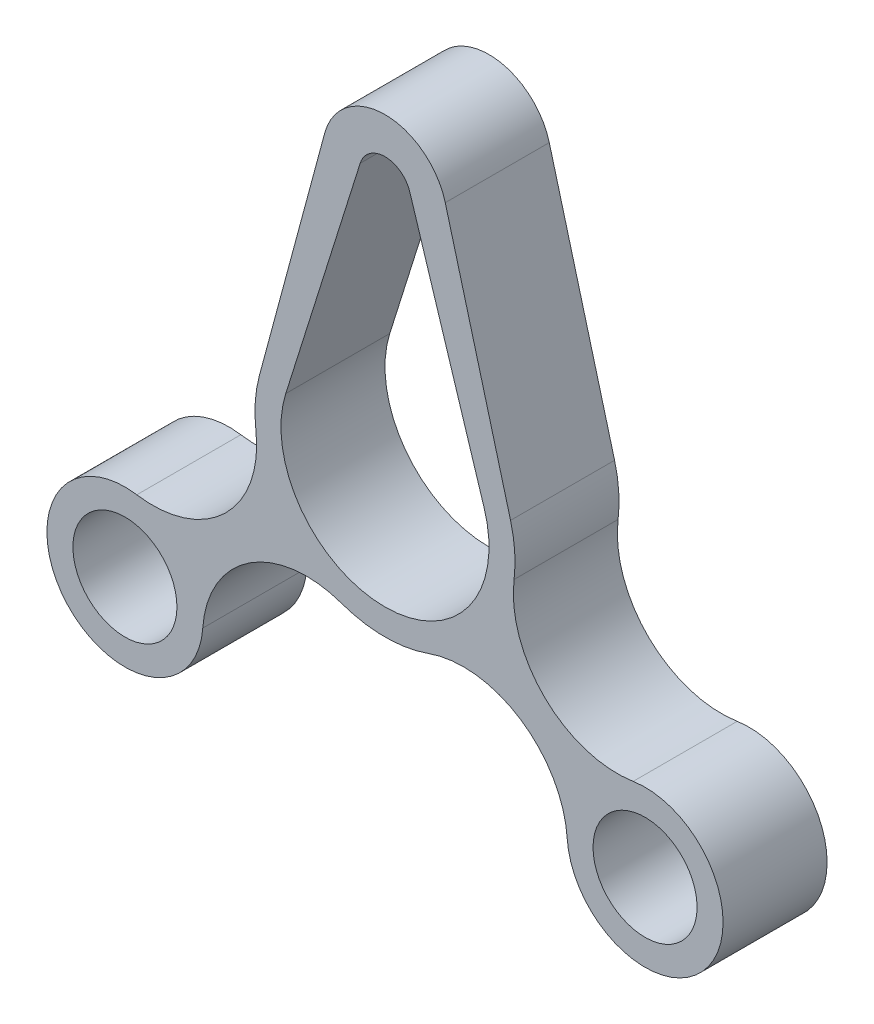
ISO-10303-21;
HEADER;
FILE_DESCRIPTION(('STEP AP214'),'2;1');
FILE_NAME('part.step','',(''),(''),'','','');
FILE_SCHEMA(('AUTOMOTIVE_DESIGN { 1 0 10303 214 1 1 1 1 }'));
ENDSEC;
DATA;
#1=APPLICATION_CONTEXT('core data for automotive mechanical design processes');
#2=APPLICATION_PROTOCOL_DEFINITION('international standard','automotive_design',2000,#1);
#3=PRODUCT_CONTEXT('',#1,'mechanical');
#4=PRODUCT('Part','Part','',(#3));
#5=PRODUCT_RELATED_PRODUCT_CATEGORY('part','',(#4));
#6=PRODUCT_DEFINITION_FORMATION('','',#4);
#7=PRODUCT_DEFINITION_CONTEXT('part definition',#1,'design');
#8=PRODUCT_DEFINITION('design','',#6,#7);
#9=PRODUCT_DEFINITION_SHAPE('','',#8);
#10=(LENGTH_UNIT() NAMED_UNIT(*) SI_UNIT(.MILLI.,.METRE.));
#11=(NAMED_UNIT(*) PLANE_ANGLE_UNIT() SI_UNIT($,.RADIAN.));
#12=(NAMED_UNIT(*) SI_UNIT($,.STERADIAN.) SOLID_ANGLE_UNIT());
#13=UNCERTAINTY_MEASURE_WITH_UNIT(LENGTH_MEASURE(1.E-05),#10,'distance_accuracy_value','');
#14=(GEOMETRIC_REPRESENTATION_CONTEXT(3) GLOBAL_UNCERTAINTY_ASSIGNED_CONTEXT((#13)) GLOBAL_UNIT_ASSIGNED_CONTEXT((#10,
#11,#12)) REPRESENTATION_CONTEXT('',''));
#15=CARTESIAN_POINT('',(0.,0.,0.));
#16=DIRECTION('',(0.,0.,1.));
#17=DIRECTION('',(1.,0.,0.));
#18=AXIS2_PLACEMENT_3D('',#15,#16,#17);
#19=CARTESIAN_POINT('',(-44.6739033054664,-5.40762086816695,10.));
#20=DIRECTION('',(0.,0.,1.));
#21=DIRECTION('',(1.,0.,0.));
#22=AXIS2_PLACEMENT_3D('',#19,#20,#21);
#23=PLANE('',#22);
#24=CARTESIAN_POINT('',(-50.,-40.,10.));
#25=DIRECTION('',(0.,0.,1.));
#26=DIRECTION('',(1.,0.,0.));
#27=AXIS2_PLACEMENT_3D('',#24,#25,#26);
#28=CIRCLE('',#27,10.);
#29=CARTESIAN_POINT('',(-40.,-40.,10.));
#30=VERTEX_POINT('',#29);
#31=EDGE_CURVE('E192',#30,#30,#28,.T.);
#32=ORIENTED_EDGE('',*,*,#31,.F.);
#33=EDGE_LOOP('',(#32));
#34=FACE_BOUND('',#33,.T.);
#35=CARTESIAN_POINT('',(-44.6739033054664,-5.40762086816695,10.));
#36=DIRECTION('',(0.,0.,-1.));
#37=DIRECTION('',(1.,0.,0.));
#38=AXIS2_PLACEMENT_3D('',#35,#36,#37);
#39=CIRCLE('',#38,20.);
#40=CARTESIAN_POINT('',(-24.8188351697036,-3.0042338156483,10.));
#41=VERTEX_POINT('',#40);
#42=CARTESIAN_POINT('',(-47.7173871309142,-25.1746946577858,10.));
#43=VERTEX_POINT('',#42);
#44=EDGE_CURVE('E198',#41,#43,#39,.T.);
#45=ORIENTED_EDGE('',*,*,#44,.T.);
#46=CARTESIAN_POINT('',(-50.,-40.,10.));
#47=DIRECTION('',(0.,0.,1.));
#48=DIRECTION('',(1.,0.,0.));
#49=AXIS2_PLACEMENT_3D('',#46,#47,#48);
#50=CIRCLE('',#49,15.);
#51=CARTESIAN_POINT('',(-35.0352261095039,-41.0273959345487,10.));
#52=VERTEX_POINT('',#51);
#53=EDGE_CURVE('E201',#43,#52,#50,.T.);
#54=ORIENTED_EDGE('',*,*,#53,.T.);
#55=CARTESIAN_POINT('',(-15.0821942555092,-42.3972571806135,10.));
#56=DIRECTION('',(0.,0.,-1.));
#57=DIRECTION('',(-1.,0.,0.));
#58=AXIS2_PLACEMENT_3D('',#55,#56,#57);
#59=CIRCLE('',#58,20.);
#60=CARTESIAN_POINT('',(-8.3789968086162,-23.5540317670075,10.));
#61=VERTEX_POINT('',#60);
#62=EDGE_CURVE('E204',#52,#61,#59,.T.);
#63=ORIENTED_EDGE('',*,*,#62,.T.);
#64=CARTESIAN_POINT('',(0.,0.,10.));
#65=DIRECTION('',(0.,0.,1.));
#66=DIRECTION('',(1.,0.,0.));
#67=AXIS2_PLACEMENT_3D('',#64,#65,#66);
#68=CIRCLE('',#67,25.);
#69=CARTESIAN_POINT('',(8.37899680861619,-23.5540317670075,10.));
#70=VERTEX_POINT('',#69);
#71=EDGE_CURVE('E206',#61,#70,#68,.T.);
#72=ORIENTED_EDGE('',*,*,#71,.T.);
#73=CARTESIAN_POINT('',(15.0821942555092,-42.3972571806135,10.));
#74=DIRECTION('',(0.,0.,-1.));
#75=DIRECTION('',(1.,0.,0.));
#76=AXIS2_PLACEMENT_3D('',#73,#74,#75);
#77=CIRCLE('',#76,20.);
#78=CARTESIAN_POINT('',(35.0352261095039,-41.0273959345487,10.));
#79=VERTEX_POINT('',#78);
#80=EDGE_CURVE('E208',#70,#79,#77,.T.);
#81=ORIENTED_EDGE('',*,*,#80,.T.);
#82=CARTESIAN_POINT('',(50.,-40.,10.));
#83=DIRECTION('',(0.,0.,1.));
#84=DIRECTION('',(-1.,0.,0.));
#85=AXIS2_PLACEMENT_3D('',#82,#83,#84);
#86=CIRCLE('',#85,15.);
#87=CARTESIAN_POINT('',(47.7173871309142,-25.1746946577858,10.));
#88=VERTEX_POINT('',#87);
#89=EDGE_CURVE('E210',#79,#88,#86,.T.);
#90=ORIENTED_EDGE('',*,*,#89,.T.);
#91=CARTESIAN_POINT('',(44.6739033054664,-5.40762086816695,10.));
#92=DIRECTION('',(0.,0.,-1.));
#93=DIRECTION('',(-1.,0.,0.));
#94=AXIS2_PLACEMENT_3D('',#91,#92,#93);
#95=CIRCLE('',#94,20.);
#96=CARTESIAN_POINT('',(24.8188351697036,-3.00423381564831,10.));
#97=VERTEX_POINT('',#96);
#98=EDGE_CURVE('E212',#88,#97,#95,.T.);
#99=ORIENTED_EDGE('',*,*,#98,.T.);
#100=CARTESIAN_POINT('',(0.,0.,10.));
#101=DIRECTION('',(0.,0.,1.));
#102=DIRECTION('',(1.,0.,0.));
#103=AXIS2_PLACEMENT_3D('',#100,#101,#102);
#104=CIRCLE('',#103,25.);
#105=CARTESIAN_POINT('',(24.1402154091466,6.5,10.));
#106=VERTEX_POINT('',#105);
#107=EDGE_CURVE('E214',#97,#106,#104,.T.);
#108=ORIENTED_EDGE('',*,*,#107,.T.);
#109=DIRECTION('',(-0.26,0.965608616365865,0.));
#110=VECTOR('',#109,1.);
#111=CARTESIAN_POINT('',(24.1402154091466,6.5,10.));
#112=LINE('',#111,#110);
#113=CARTESIAN_POINT('',(11.5873033963904,53.12,10.));
#114=VERTEX_POINT('',#113);
#115=EDGE_CURVE('E216',#106,#114,#112,.T.);
#116=ORIENTED_EDGE('',*,*,#115,.T.);
#117=CARTESIAN_POINT('',(0.,50.,10.));
#118=DIRECTION('',(0.,0.,1.));
#119=DIRECTION('',(1.,0.,0.));
#120=AXIS2_PLACEMENT_3D('',#117,#118,#119);
#121=CIRCLE('',#120,12.);
#122=CARTESIAN_POINT('',(-11.5873033963904,53.12,10.));
#123=VERTEX_POINT('',#122);
#124=EDGE_CURVE('E218',#114,#123,#121,.T.);
#125=ORIENTED_EDGE('',*,*,#124,.T.);
#126=DIRECTION('',(-0.26,-0.965608616365865,0.));
#127=VECTOR('',#126,1.);
#128=CARTESIAN_POINT('',(-24.1402154091466,6.5,10.));
#129=LINE('',#128,#127);
#130=CARTESIAN_POINT('',(-24.1402154091466,6.5,10.));
#131=VERTEX_POINT('',#130);
#132=EDGE_CURVE('E220',#123,#131,#129,.T.);
#133=ORIENTED_EDGE('',*,*,#132,.T.);
#134=CARTESIAN_POINT('',(0.,0.,10.));
#135=DIRECTION('',(0.,0.,1.));
#136=DIRECTION('',(1.,0.,0.));
#137=AXIS2_PLACEMENT_3D('',#134,#135,#136);
#138=CIRCLE('',#137,25.);
#139=EDGE_CURVE('E222',#131,#41,#138,.T.);
#140=ORIENTED_EDGE('',*,*,#139,.T.);
#141=EDGE_LOOP('',(#45,#54,#63,#72,#81,#90,#99,#108,#116,#125,#133,#140));
#142=FACE_BOUND('',#141,.T.);
#143=CARTESIAN_POINT('',(50.,-40.,10.));
#144=DIRECTION('',(0.,0.,1.));
#145=DIRECTION('',(-1.,0.,0.));
#146=AXIS2_PLACEMENT_3D('',#143,#144,#145);
#147=CIRCLE('',#146,10.);
#148=CARTESIAN_POINT('',(40.,-40.,10.));
#149=VERTEX_POINT('',#148);
#150=EDGE_CURVE('E186',#149,#149,#147,.T.);
#151=ORIENTED_EDGE('',*,*,#150,.F.);
#152=EDGE_LOOP('',(#151));
#153=FACE_BOUND('',#152,.T.);
#154=DIRECTION('',(-0.3,0.953939201416946,0.));
#155=VECTOR('',#154,1.);
#156=CARTESIAN_POINT('',(19.0787840283389,6.,10.));
#157=LINE('',#156,#155);
#158=CARTESIAN_POINT('',(19.0787840283389,6.,10.));
#159=VERTEX_POINT('',#158);
#160=CARTESIAN_POINT('',(4.76969600708474,51.5,10.));
#161=VERTEX_POINT('',#160);
#162=EDGE_CURVE('E158',#159,#161,#157,.T.);
#163=ORIENTED_EDGE('',*,*,#162,.F.);
#164=CARTESIAN_POINT('',(0.,0.,10.));
#165=DIRECTION('',(0.,0.,1.));
#166=DIRECTION('',(1.,0.,0.));
#167=AXIS2_PLACEMENT_3D('',#164,#165,#166);
#168=CIRCLE('',#167,20.);
#169=CARTESIAN_POINT('',(-19.0787840283389,6.,10.));
#170=VERTEX_POINT('',#169);
#171=EDGE_CURVE('E150',#170,#159,#168,.T.);
#172=ORIENTED_EDGE('',*,*,#171,.F.);
#173=DIRECTION('',(-0.3,-0.953939201416946,0.));
#174=VECTOR('',#173,1.);
#175=CARTESIAN_POINT('',(-19.0787840283389,6.,10.));
#176=LINE('',#175,#174);
#177=CARTESIAN_POINT('',(-4.76969600708474,51.5,10.));
#178=VERTEX_POINT('',#177);
#179=EDGE_CURVE('E172',#178,#170,#176,.T.);
#180=ORIENTED_EDGE('',*,*,#179,.F.);
#181=CARTESIAN_POINT('',(0.,50.,10.));
#182=DIRECTION('',(0.,0.,1.));
#183=DIRECTION('',(1.,0.,0.));
#184=AXIS2_PLACEMENT_3D('',#181,#182,#183);
#185=CIRCLE('',#184,5.00000000000001);
#186=EDGE_CURVE('E170',#161,#178,#185,.T.);
#187=ORIENTED_EDGE('',*,*,#186,.F.);
#188=EDGE_LOOP('',(#163,#172,#180,#187));
#189=FACE_BOUND('',#188,.T.);
#190=ADVANCED_FACE('F37',(#34,#142,#153,#189),#23,.T.);
#191=CARTESIAN_POINT('',(-44.6739033054664,-5.40762086816695,-10.));
#192=DIRECTION('',(0.,0.,1.));
#193=DIRECTION('',(1.,0.,0.));
#194=AXIS2_PLACEMENT_3D('',#191,#192,#193);
#195=PLANE('',#194);
#196=CARTESIAN_POINT('',(50.,-40.,-10.));
#197=DIRECTION('',(0.,0.,1.));
#198=DIRECTION('',(-1.,0.,0.));
#199=AXIS2_PLACEMENT_3D('',#196,#197,#198);
#200=CIRCLE('',#199,10.);
#201=CARTESIAN_POINT('',(40.,-40.,-10.));
#202=VERTEX_POINT('',#201);
#203=EDGE_CURVE('E166',#202,#202,#200,.T.);
#204=ORIENTED_EDGE('',*,*,#203,.T.);
#205=EDGE_LOOP('',(#204));
#206=FACE_BOUND('',#205,.T.);
#207=CARTESIAN_POINT('',(-50.,-40.,-10.));
#208=DIRECTION('',(0.,0.,1.));
#209=DIRECTION('',(1.,0.,0.));
#210=AXIS2_PLACEMENT_3D('',#207,#208,#209);
#211=CIRCLE('',#210,10.);
#212=CARTESIAN_POINT('',(-40.,-40.,-10.));
#213=VERTEX_POINT('',#212);
#214=EDGE_CURVE('E189',#213,#213,#211,.T.);
#215=ORIENTED_EDGE('',*,*,#214,.T.);
#216=EDGE_LOOP('',(#215));
#217=FACE_BOUND('',#216,.T.);
#218=CARTESIAN_POINT('',(-44.6739033054664,-5.40762086816695,-10.));
#219=DIRECTION('',(0.,0.,-1.));
#220=DIRECTION('',(1.,0.,0.));
#221=AXIS2_PLACEMENT_3D('',#218,#219,#220);
#222=CIRCLE('',#221,20.);
#223=CARTESIAN_POINT('',(-24.8188351697036,-3.0042338156483,-10.));
#224=VERTEX_POINT('',#223);
#225=CARTESIAN_POINT('',(-47.7173871309142,-25.1746946577858,-10.));
#226=VERTEX_POINT('',#225);
#227=EDGE_CURVE('E195',#224,#226,#222,.T.);
#228=ORIENTED_EDGE('',*,*,#227,.F.);
#229=CARTESIAN_POINT('',(0.,0.,-10.));
#230=DIRECTION('',(0.,0.,1.));
#231=DIRECTION('',(1.,0.,0.));
#232=AXIS2_PLACEMENT_3D('',#229,#230,#231);
#233=CIRCLE('',#232,25.);
#234=CARTESIAN_POINT('',(-24.1402154091466,6.5,-10.));
#235=VERTEX_POINT('',#234);
#236=EDGE_CURVE('E202',#235,#224,#233,.T.);
#237=ORIENTED_EDGE('',*,*,#236,.F.);
#238=DIRECTION('',(-0.26,-0.965608616365865,0.));
#239=VECTOR('',#238,1.);
#240=CARTESIAN_POINT('',(-24.1402154091466,6.5,-10.));
#241=LINE('',#240,#239);
#242=CARTESIAN_POINT('',(-11.5873033963904,53.12,-10.));
#243=VERTEX_POINT('',#242);
#244=EDGE_CURVE('E245',#243,#235,#241,.T.);
#245=ORIENTED_EDGE('',*,*,#244,.F.);
#246=CARTESIAN_POINT('',(0.,50.,-10.));
#247=DIRECTION('',(0.,0.,1.));
#248=DIRECTION('',(1.,0.,0.));
#249=AXIS2_PLACEMENT_3D('',#246,#247,#248);
#250=CIRCLE('',#249,12.);
#251=CARTESIAN_POINT('',(11.5873033963904,53.12,-10.));
#252=VERTEX_POINT('',#251);
#253=EDGE_CURVE('E243',#252,#243,#250,.T.);
#254=ORIENTED_EDGE('',*,*,#253,.F.);
#255=DIRECTION('',(-0.26,0.965608616365865,0.));
#256=VECTOR('',#255,1.);
#257=CARTESIAN_POINT('',(24.1402154091466,6.5,-10.));
#258=LINE('',#257,#256);
#259=CARTESIAN_POINT('',(24.1402154091466,6.5,-10.));
#260=VERTEX_POINT('',#259);
#261=EDGE_CURVE('E241',#260,#252,#258,.T.);
#262=ORIENTED_EDGE('',*,*,#261,.F.);
#263=CARTESIAN_POINT('',(0.,0.,-10.));
#264=DIRECTION('',(0.,0.,1.));
#265=DIRECTION('',(1.,0.,0.));
#266=AXIS2_PLACEMENT_3D('',#263,#264,#265);
#267=CIRCLE('',#266,25.);
#268=CARTESIAN_POINT('',(24.8188351697036,-3.00423381564831,-10.));
#269=VERTEX_POINT('',#268);
#270=EDGE_CURVE('E239',#269,#260,#267,.T.);
#271=ORIENTED_EDGE('',*,*,#270,.F.);
#272=CARTESIAN_POINT('',(44.6739033054664,-5.40762086816695,-10.));
#273=DIRECTION('',(0.,0.,-1.));
#274=DIRECTION('',(-1.,0.,0.));
#275=AXIS2_PLACEMENT_3D('',#272,#273,#274);
#276=CIRCLE('',#275,20.);
#277=CARTESIAN_POINT('',(47.7173871309142,-25.1746946577858,-10.));
#278=VERTEX_POINT('',#277);
#279=EDGE_CURVE('E237',#278,#269,#276,.T.);
#280=ORIENTED_EDGE('',*,*,#279,.F.);
#281=CARTESIAN_POINT('',(50.,-40.,-10.));
#282=DIRECTION('',(0.,0.,1.));
#283=DIRECTION('',(-1.,0.,0.));
#284=AXIS2_PLACEMENT_3D('',#281,#282,#283);
#285=CIRCLE('',#284,15.);
#286=CARTESIAN_POINT('',(35.0352261095039,-41.0273959345487,-10.));
#287=VERTEX_POINT('',#286);
#288=EDGE_CURVE('E235',#287,#278,#285,.T.);
#289=ORIENTED_EDGE('',*,*,#288,.F.);
#290=CARTESIAN_POINT('',(15.0821942555092,-42.3972571806135,-10.));
#291=DIRECTION('',(0.,0.,-1.));
#292=DIRECTION('',(1.,0.,0.));
#293=AXIS2_PLACEMENT_3D('',#290,#291,#292);
#294=CIRCLE('',#293,20.);
#295=CARTESIAN_POINT('',(8.37899680861619,-23.5540317670075,-10.));
#296=VERTEX_POINT('',#295);
#297=EDGE_CURVE('E233',#296,#287,#294,.T.);
#298=ORIENTED_EDGE('',*,*,#297,.F.);
#299=CARTESIAN_POINT('',(0.,0.,-10.));
#300=DIRECTION('',(0.,0.,1.));
#301=DIRECTION('',(1.,0.,0.));
#302=AXIS2_PLACEMENT_3D('',#299,#300,#301);
#303=CIRCLE('',#302,25.);
#304=CARTESIAN_POINT('',(-8.3789968086162,-23.5540317670075,-10.));
#305=VERTEX_POINT('',#304);
#306=EDGE_CURVE('E231',#305,#296,#303,.T.);
#307=ORIENTED_EDGE('',*,*,#306,.F.);
#308=CARTESIAN_POINT('',(-15.0821942555092,-42.3972571806135,-10.));
#309=DIRECTION('',(0.,0.,-1.));
#310=DIRECTION('',(-1.,0.,0.));
#311=AXIS2_PLACEMENT_3D('',#308,#309,#310);
#312=CIRCLE('',#311,20.);
#313=CARTESIAN_POINT('',(-35.0352261095039,-41.0273959345487,-10.));
#314=VERTEX_POINT('',#313);
#315=EDGE_CURVE('E229',#314,#305,#312,.T.);
#316=ORIENTED_EDGE('',*,*,#315,.F.);
#317=CARTESIAN_POINT('',(-50.,-40.,-10.));
#318=DIRECTION('',(0.,0.,1.));
#319=DIRECTION('',(1.,0.,0.));
#320=AXIS2_PLACEMENT_3D('',#317,#318,#319);
#321=CIRCLE('',#320,15.);
#322=EDGE_CURVE('E227',#226,#314,#321,.T.);
#323=ORIENTED_EDGE('',*,*,#322,.F.);
#324=EDGE_LOOP('',(#228,#237,#245,#254,#262,#271,#280,#289,#298,#307,#316,#323));
#325=FACE_BOUND('',#324,.T.);
#326=CARTESIAN_POINT('',(0.,0.,-10.));
#327=DIRECTION('',(0.,0.,1.));
#328=DIRECTION('',(1.,0.,0.));
#329=AXIS2_PLACEMENT_3D('',#326,#327,#328);
#330=CIRCLE('',#329,20.);
#331=CARTESIAN_POINT('',(-19.0787840283389,5.99999999999999,-10.));
#332=VERTEX_POINT('',#331);
#333=CARTESIAN_POINT('',(19.0787840283389,6.,-10.));
#334=VERTEX_POINT('',#333);
#335=EDGE_CURVE('E60',#332,#334,#330,.T.);
#336=ORIENTED_EDGE('',*,*,#335,.T.);
#337=DIRECTION('',(-0.3,0.953939201416946,0.));
#338=VECTOR('',#337,1.);
#339=CARTESIAN_POINT('',(19.0787840283389,6.,-10.));
#340=LINE('',#339,#338);
#341=CARTESIAN_POINT('',(4.76969600708474,51.5,-10.));
#342=VERTEX_POINT('',#341);
#343=EDGE_CURVE('E165',#334,#342,#340,.T.);
#344=ORIENTED_EDGE('',*,*,#343,.T.);
#345=CARTESIAN_POINT('',(0.,50.,-10.));
#346=DIRECTION('',(0.,0.,1.));
#347=DIRECTION('',(1.,0.,0.));
#348=AXIS2_PLACEMENT_3D('',#345,#346,#347);
#349=CIRCLE('',#348,5.00000000000001);
#350=CARTESIAN_POINT('',(-4.76969600708474,51.5,-10.));
#351=VERTEX_POINT('',#350);
#352=EDGE_CURVE('E178',#342,#351,#349,.T.);
#353=ORIENTED_EDGE('',*,*,#352,.T.);
#354=DIRECTION('',(-0.3,-0.953939201416946,0.));
#355=VECTOR('',#354,1.);
#356=CARTESIAN_POINT('',(-19.0787840283389,6.,-10.));
#357=LINE('',#356,#355);
#358=EDGE_CURVE('E159',#351,#332,#357,.T.);
#359=ORIENTED_EDGE('',*,*,#358,.T.);
#360=EDGE_LOOP('',(#336,#344,#353,#359));
#361=FACE_BOUND('',#360,.T.);
#362=ADVANCED_FACE('F287',(#206,#217,#325,#361),#195,.F.);
#363=CARTESIAN_POINT('',(-44.6739033054664,-5.40762086816695,10.));
#364=DIRECTION('',(0.,0.,-1.));
#365=DIRECTION('',(-1.,0.,0.));
#366=AXIS2_PLACEMENT_3D('',#363,#364,#365);
#367=CYLINDRICAL_SURFACE('',#366,20.);
#368=ORIENTED_EDGE('',*,*,#227,.T.);
#369=DIRECTION('',(0.,0.,-1.));
#370=VECTOR('',#369,1.);
#371=CARTESIAN_POINT('',(-47.7173871309142,-25.1746946577858,10.));
#372=LINE('',#371,#370);
#373=EDGE_CURVE('E11',#43,#226,#372,.T.);
#374=ORIENTED_EDGE('',*,*,#373,.F.);
#375=ORIENTED_EDGE('',*,*,#44,.F.);
#376=DIRECTION('',(0.,0.,-1.));
#377=VECTOR('',#376,1.);
#378=CARTESIAN_POINT('',(-24.8188351697036,-3.0042338156483,10.));
#379=LINE('',#378,#377);
#380=EDGE_CURVE('E224',#41,#224,#379,.T.);
#381=ORIENTED_EDGE('',*,*,#380,.T.);
#382=EDGE_LOOP('',(#368,#374,#375,#381));
#383=FACE_BOUND('',#382,.T.);
#384=ADVANCED_FACE('F39',(#383),#367,.F.);
#385=CARTESIAN_POINT('',(-50.,-40.,10.));
#386=DIRECTION('',(0.,0.,-1.));
#387=DIRECTION('',(-1.,0.,0.));
#388=AXIS2_PLACEMENT_3D('',#385,#386,#387);
#389=CYLINDRICAL_SURFACE('',#388,15.);
#390=ORIENTED_EDGE('',*,*,#322,.T.);
#391=DIRECTION('',(0.,0.,-1.));
#392=VECTOR('',#391,1.);
#393=CARTESIAN_POINT('',(-35.0352261095039,-41.0273959345487,10.));
#394=LINE('',#393,#392);
#395=EDGE_CURVE('E45',#52,#314,#394,.T.);
#396=ORIENTED_EDGE('',*,*,#395,.F.);
#397=ORIENTED_EDGE('',*,*,#53,.F.);
#398=ORIENTED_EDGE('',*,*,#373,.T.);
#399=EDGE_LOOP('',(#390,#396,#397,#398));
#400=FACE_BOUND('',#399,.T.);
#401=ADVANCED_FACE('F305',(#400),#389,.T.);
#402=CARTESIAN_POINT('',(-15.0821942555092,-42.3972571806135,10.));
#403=DIRECTION('',(0.,0.,-1.));
#404=DIRECTION('',(-1.,0.,0.));
#405=AXIS2_PLACEMENT_3D('',#402,#403,#404);
#406=CYLINDRICAL_SURFACE('',#405,20.);
#407=ORIENTED_EDGE('',*,*,#315,.T.);
#408=DIRECTION('',(0.,0.,-1.));
#409=VECTOR('',#408,1.);
#410=CARTESIAN_POINT('',(-8.3789968086162,-23.5540317670075,10.));
#411=LINE('',#410,#409);
#412=EDGE_CURVE('E274',#61,#305,#411,.T.);
#413=ORIENTED_EDGE('',*,*,#412,.F.);
#414=ORIENTED_EDGE('',*,*,#62,.F.);
#415=ORIENTED_EDGE('',*,*,#395,.T.);
#416=EDGE_LOOP('',(#407,#413,#414,#415));
#417=FACE_BOUND('',#416,.T.);
#418=ADVANCED_FACE('F281',(#417),#406,.F.);
#419=CARTESIAN_POINT('',(0.,0.,10.));
#420=DIRECTION('',(0.,0.,-1.));
#421=DIRECTION('',(-1.,0.,0.));
#422=AXIS2_PLACEMENT_3D('',#419,#420,#421);
#423=CYLINDRICAL_SURFACE('',#422,25.);
#424=ORIENTED_EDGE('',*,*,#306,.T.);
#425=DIRECTION('',(0.,0.,-1.));
#426=VECTOR('',#425,1.);
#427=CARTESIAN_POINT('',(8.37899680861619,-23.5540317670075,10.));
#428=LINE('',#427,#426);
#429=EDGE_CURVE('E271',#70,#296,#428,.T.);
#430=ORIENTED_EDGE('',*,*,#429,.F.);
#431=ORIENTED_EDGE('',*,*,#71,.F.);
#432=ORIENTED_EDGE('',*,*,#412,.T.);
#433=EDGE_LOOP('',(#424,#430,#431,#432));
#434=FACE_BOUND('',#433,.T.);
#435=ADVANCED_FACE('F293',(#434),#423,.T.);
#436=CARTESIAN_POINT('',(15.0821942555092,-42.3972571806135,10.));
#437=DIRECTION('',(0.,0.,-1.));
#438=DIRECTION('',(-1.,0.,0.));
#439=AXIS2_PLACEMENT_3D('',#436,#437,#438);
#440=CYLINDRICAL_SURFACE('',#439,20.);
#441=ORIENTED_EDGE('',*,*,#297,.T.);
#442=DIRECTION('',(0.,0.,-1.));
#443=VECTOR('',#442,1.);
#444=CARTESIAN_POINT('',(35.0352261095039,-41.0273959345487,10.));
#445=LINE('',#444,#443);
#446=EDGE_CURVE('E268',#79,#287,#445,.T.);
#447=ORIENTED_EDGE('',*,*,#446,.F.);
#448=ORIENTED_EDGE('',*,*,#80,.F.);
#449=ORIENTED_EDGE('',*,*,#429,.T.);
#450=EDGE_LOOP('',(#441,#447,#448,#449));
#451=FACE_BOUND('',#450,.T.);
#452=ADVANCED_FACE('F297',(#451),#440,.F.);
#453=CARTESIAN_POINT('',(50.,-40.,10.));
#454=DIRECTION('',(0.,0.,-1.));
#455=DIRECTION('',(-1.,0.,0.));
#456=AXIS2_PLACEMENT_3D('',#453,#454,#455);
#457=CYLINDRICAL_SURFACE('',#456,15.);
#458=ORIENTED_EDGE('',*,*,#288,.T.);
#459=DIRECTION('',(0.,0.,-1.));
#460=VECTOR('',#459,1.);
#461=CARTESIAN_POINT('',(47.7173871309142,-25.1746946577858,10.));
#462=LINE('',#461,#460);
#463=EDGE_CURVE('E265',#88,#278,#462,.T.);
#464=ORIENTED_EDGE('',*,*,#463,.F.);
#465=ORIENTED_EDGE('',*,*,#89,.F.);
#466=ORIENTED_EDGE('',*,*,#446,.T.);
#467=EDGE_LOOP('',(#458,#464,#465,#466));
#468=FACE_BOUND('',#467,.T.);
#469=ADVANCED_FACE('F338',(#468),#457,.T.);
#470=CARTESIAN_POINT('',(44.6739033054664,-5.40762086816695,10.));
#471=DIRECTION('',(0.,0.,-1.));
#472=DIRECTION('',(-1.,0.,0.));
#473=AXIS2_PLACEMENT_3D('',#470,#471,#472);
#474=CYLINDRICAL_SURFACE('',#473,20.);
#475=ORIENTED_EDGE('',*,*,#279,.T.);
#476=DIRECTION('',(0.,0.,-1.));
#477=VECTOR('',#476,1.);
#478=CARTESIAN_POINT('',(24.8188351697036,-3.00423381564831,10.));
#479=LINE('',#478,#477);
#480=EDGE_CURVE('E262',#97,#269,#479,.T.);
#481=ORIENTED_EDGE('',*,*,#480,.F.);
#482=ORIENTED_EDGE('',*,*,#98,.F.);
#483=ORIENTED_EDGE('',*,*,#463,.T.);
#484=EDGE_LOOP('',(#475,#481,#482,#483));
#485=FACE_BOUND('',#484,.T.);
#486=ADVANCED_FACE('F336',(#485),#474,.F.);
#487=CARTESIAN_POINT('',(0.,0.,10.));
#488=DIRECTION('',(0.,0.,-1.));
#489=DIRECTION('',(-1.,0.,0.));
#490=AXIS2_PLACEMENT_3D('',#487,#488,#489);
#491=CYLINDRICAL_SURFACE('',#490,25.);
#492=ORIENTED_EDGE('',*,*,#270,.T.);
#493=DIRECTION('',(0.,0.,-1.));
#494=VECTOR('',#493,1.);
#495=CARTESIAN_POINT('',(24.1402154091466,6.5,10.));
#496=LINE('',#495,#494);
#497=EDGE_CURVE('E259',#106,#260,#496,.T.);
#498=ORIENTED_EDGE('',*,*,#497,.F.);
#499=ORIENTED_EDGE('',*,*,#107,.F.);
#500=ORIENTED_EDGE('',*,*,#480,.T.);
#501=EDGE_LOOP('',(#492,#498,#499,#500));
#502=FACE_BOUND('',#501,.T.);
#503=ADVANCED_FACE('F332',(#502),#491,.T.);
#504=CARTESIAN_POINT('',(24.1402154091466,6.5,10.));
#505=DIRECTION('',(-0.965608616365865,-0.26,0.));
#506=DIRECTION('',(0.26,-0.965608616365865,0.));
#507=AXIS2_PLACEMENT_3D('',#504,#505,#506);
#508=PLANE('',#507);
#509=ORIENTED_EDGE('',*,*,#261,.T.);
#510=DIRECTION('',(0.,0.,-1.));
#511=VECTOR('',#510,1.);
#512=CARTESIAN_POINT('',(11.5873033963904,53.12,10.));
#513=LINE('',#512,#511);
#514=EDGE_CURVE('E256',#114,#252,#513,.T.);
#515=ORIENTED_EDGE('',*,*,#514,.F.);
#516=ORIENTED_EDGE('',*,*,#115,.F.);
#517=ORIENTED_EDGE('',*,*,#497,.T.);
#518=EDGE_LOOP('',(#509,#515,#516,#517));
#519=FACE_BOUND('',#518,.T.);
#520=ADVANCED_FACE('F327',(#519),#508,.F.);
#521=CARTESIAN_POINT('',(0.,50.,10.));
#522=DIRECTION('',(0.,0.,-1.));
#523=DIRECTION('',(-1.,0.,0.));
#524=AXIS2_PLACEMENT_3D('',#521,#522,#523);
#525=CYLINDRICAL_SURFACE('',#524,12.);
#526=ORIENTED_EDGE('',*,*,#253,.T.);
#527=DIRECTION('',(0.,0.,-1.));
#528=VECTOR('',#527,1.);
#529=CARTESIAN_POINT('',(-11.5873033963904,53.12,10.));
#530=LINE('',#529,#528);
#531=EDGE_CURVE('E253',#123,#243,#530,.T.);
#532=ORIENTED_EDGE('',*,*,#531,.F.);
#533=ORIENTED_EDGE('',*,*,#124,.F.);
#534=ORIENTED_EDGE('',*,*,#514,.T.);
#535=EDGE_LOOP('',(#526,#532,#533,#534));
#536=FACE_BOUND('',#535,.T.);
#537=ADVANCED_FACE('F321',(#536),#525,.T.);
#538=CARTESIAN_POINT('',(-24.1402154091466,6.5,10.));
#539=DIRECTION('',(0.965608616365865,-0.26,0.));
#540=DIRECTION('',(0.26,0.965608616365865,0.));
#541=AXIS2_PLACEMENT_3D('',#538,#539,#540);
#542=PLANE('',#541);
#543=ORIENTED_EDGE('',*,*,#244,.T.);
#544=DIRECTION('',(0.,0.,-1.));
#545=VECTOR('',#544,1.);
#546=CARTESIAN_POINT('',(-24.1402154091466,6.5,10.));
#547=LINE('',#546,#545);
#548=EDGE_CURVE('E250',#131,#235,#547,.T.);
#549=ORIENTED_EDGE('',*,*,#548,.F.);
#550=ORIENTED_EDGE('',*,*,#132,.F.);
#551=ORIENTED_EDGE('',*,*,#531,.T.);
#552=EDGE_LOOP('',(#543,#549,#550,#551));
#553=FACE_BOUND('',#552,.T.);
#554=ADVANCED_FACE('F317',(#553),#542,.F.);
#555=CARTESIAN_POINT('',(0.,0.,10.));
#556=DIRECTION('',(0.,0.,-1.));
#557=DIRECTION('',(-1.,0.,0.));
#558=AXIS2_PLACEMENT_3D('',#555,#556,#557);
#559=CYLINDRICAL_SURFACE('',#558,25.);
#560=ORIENTED_EDGE('',*,*,#236,.T.);
#561=ORIENTED_EDGE('',*,*,#380,.F.);
#562=ORIENTED_EDGE('',*,*,#139,.F.);
#563=ORIENTED_EDGE('',*,*,#548,.T.);
#564=EDGE_LOOP('',(#560,#561,#562,#563));
#565=FACE_BOUND('',#564,.T.);
#566=ADVANCED_FACE('F312',(#565),#559,.T.);
#567=CARTESIAN_POINT('',(-50.,-40.,10.));
#568=DIRECTION('',(0.,0.,-1.));
#569=DIRECTION('',(-1.,0.,0.));
#570=AXIS2_PLACEMENT_3D('',#567,#568,#569);
#571=CYLINDRICAL_SURFACE('',#570,10.);
#572=ORIENTED_EDGE('',*,*,#31,.T.);
#573=EDGE_LOOP('',(#572));
#574=FACE_BOUND('',#573,.T.);
#575=ORIENTED_EDGE('',*,*,#214,.F.);
#576=EDGE_LOOP('',(#575));
#577=FACE_BOUND('',#576,.T.);
#578=ADVANCED_FACE('F357',(#574,#577),#571,.F.);
#579=CARTESIAN_POINT('',(50.,-40.,10.));
#580=DIRECTION('',(0.,0.,-1.));
#581=DIRECTION('',(-1.,0.,0.));
#582=AXIS2_PLACEMENT_3D('',#579,#580,#581);
#583=CYLINDRICAL_SURFACE('',#582,10.);
#584=ORIENTED_EDGE('',*,*,#150,.T.);
#585=EDGE_LOOP('',(#584));
#586=FACE_BOUND('',#585,.T.);
#587=ORIENTED_EDGE('',*,*,#203,.F.);
#588=EDGE_LOOP('',(#587));
#589=FACE_BOUND('',#588,.T.);
#590=ADVANCED_FACE('F395',(#586,#589),#583,.F.);
#591=CARTESIAN_POINT('',(0.,0.,10.));
#592=DIRECTION('',(0.,0.,-1.));
#593=DIRECTION('',(-1.,0.,0.));
#594=AXIS2_PLACEMENT_3D('',#591,#592,#593);
#595=CYLINDRICAL_SURFACE('',#594,20.);
#596=ORIENTED_EDGE('',*,*,#335,.F.);
#597=DIRECTION('',(0.,0.,-1.));
#598=VECTOR('',#597,1.);
#599=CARTESIAN_POINT('',(-19.0787840283389,6.,10.));
#600=LINE('',#599,#598);
#601=EDGE_CURVE('E154',#170,#332,#600,.T.);
#602=ORIENTED_EDGE('',*,*,#601,.F.);
#603=ORIENTED_EDGE('',*,*,#171,.T.);
#604=DIRECTION('',(0.,0.,-1.));
#605=VECTOR('',#604,1.);
#606=CARTESIAN_POINT('',(19.0787840283389,6.,10.));
#607=LINE('',#606,#605);
#608=EDGE_CURVE('E153',#159,#334,#607,.T.);
#609=ORIENTED_EDGE('',*,*,#608,.T.);
#610=EDGE_LOOP('',(#596,#602,#603,#609));
#611=FACE_BOUND('',#610,.T.);
#612=ADVANCED_FACE('F152',(#611),#595,.F.);
#613=CARTESIAN_POINT('',(19.0787840283389,6.,10.));
#614=DIRECTION('',(-0.953939201416946,-0.3,0.));
#615=DIRECTION('',(0.3,-0.953939201416946,0.));
#616=AXIS2_PLACEMENT_3D('',#613,#614,#615);
#617=PLANE('',#616);
#618=ORIENTED_EDGE('',*,*,#343,.F.);
#619=ORIENTED_EDGE('',*,*,#608,.F.);
#620=ORIENTED_EDGE('',*,*,#162,.T.);
#621=DIRECTION('',(0.,0.,-1.));
#622=VECTOR('',#621,1.);
#623=CARTESIAN_POINT('',(4.76969600708474,51.5,10.));
#624=LINE('',#623,#622);
#625=EDGE_CURVE('E167',#161,#342,#624,.T.);
#626=ORIENTED_EDGE('',*,*,#625,.T.);
#627=EDGE_LOOP('',(#618,#619,#620,#626));
#628=FACE_BOUND('',#627,.T.);
#629=ADVANCED_FACE('F162',(#628),#617,.T.);
#630=CARTESIAN_POINT('',(0.,50.,10.));
#631=DIRECTION('',(0.,0.,-1.));
#632=DIRECTION('',(-1.,0.,0.));
#633=AXIS2_PLACEMENT_3D('',#630,#631,#632);
#634=CYLINDRICAL_SURFACE('',#633,5.00000000000001);
#635=ORIENTED_EDGE('',*,*,#352,.F.);
#636=ORIENTED_EDGE('',*,*,#625,.F.);
#637=ORIENTED_EDGE('',*,*,#186,.T.);
#638=DIRECTION('',(0.,0.,-1.));
#639=VECTOR('',#638,1.);
#640=CARTESIAN_POINT('',(-4.76969600708474,51.5,10.));
#641=LINE('',#640,#639);
#642=EDGE_CURVE('E52',#178,#351,#641,.T.);
#643=ORIENTED_EDGE('',*,*,#642,.T.);
#644=EDGE_LOOP('',(#635,#636,#637,#643));
#645=FACE_BOUND('',#644,.T.);
#646=ADVANCED_FACE('F414',(#645),#634,.F.);
#647=CARTESIAN_POINT('',(-19.0787840283389,6.,10.));
#648=DIRECTION('',(0.953939201416946,-0.3,0.));
#649=DIRECTION('',(0.3,0.953939201416946,0.));
#650=AXIS2_PLACEMENT_3D('',#647,#648,#649);
#651=PLANE('',#650);
#652=ORIENTED_EDGE('',*,*,#358,.F.);
#653=ORIENTED_EDGE('',*,*,#642,.F.);
#654=ORIENTED_EDGE('',*,*,#179,.T.);
#655=ORIENTED_EDGE('',*,*,#601,.T.);
#656=EDGE_LOOP('',(#652,#653,#654,#655));
#657=FACE_BOUND('',#656,.T.);
#658=ADVANCED_FACE('F421',(#657),#651,.T.);
#659=CLOSED_SHELL('',(#190,#362,#384,#401,#418,#435,#452,#469,#486,#503,#520,#537,#554,#566,
#578,#590,#612,#629,#646,#658));
#660=MANIFOLD_SOLID_BREP('B2',#659);
#661=ADVANCED_BREP_SHAPE_REPRESENTATION('',(#18,#660),#14);
#662=SHAPE_DEFINITION_REPRESENTATION(#9,#661);
ENDSEC;
END-ISO-10303-21;
